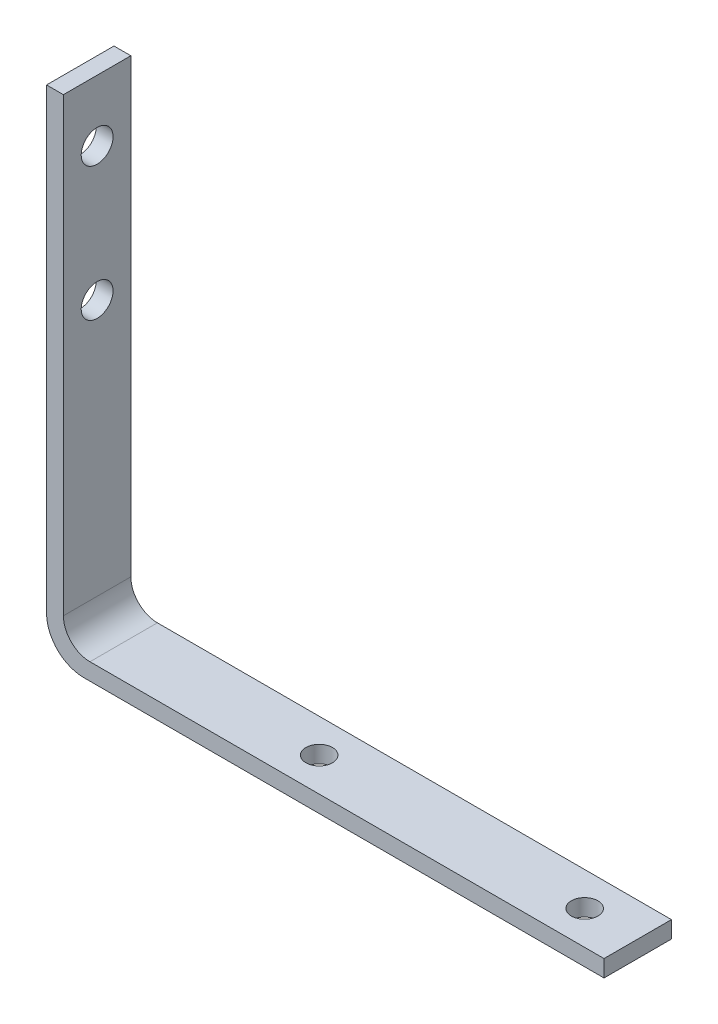
ISO-10303-21;
HEADER;
FILE_DESCRIPTION(('STEP AP214'),'2;1');
FILE_NAME('part.step','',(''),(''),'','','');
FILE_SCHEMA(('AUTOMOTIVE_DESIGN { 1 0 10303 214 1 1 1 1 }'));
ENDSEC;
DATA;
#1=APPLICATION_CONTEXT('core data for automotive mechanical design processes');
#2=APPLICATION_PROTOCOL_DEFINITION('international standard','automotive_design',2000,#1);
#3=PRODUCT_CONTEXT('',#1,'mechanical');
#4=PRODUCT('Part','Part','',(#3));
#5=PRODUCT_RELATED_PRODUCT_CATEGORY('part','',(#4));
#6=PRODUCT_DEFINITION_FORMATION('','',#4);
#7=PRODUCT_DEFINITION_CONTEXT('part definition',#1,'design');
#8=PRODUCT_DEFINITION('design','',#6,#7);
#9=PRODUCT_DEFINITION_SHAPE('','',#8);
#10=(LENGTH_UNIT() NAMED_UNIT(*) SI_UNIT(.MILLI.,.METRE.));
#11=(NAMED_UNIT(*) PLANE_ANGLE_UNIT() SI_UNIT($,.RADIAN.));
#12=(NAMED_UNIT(*) SI_UNIT($,.STERADIAN.) SOLID_ANGLE_UNIT());
#13=UNCERTAINTY_MEASURE_WITH_UNIT(LENGTH_MEASURE(1.E-05),#10,'distance_accuracy_value','');
#14=(GEOMETRIC_REPRESENTATION_CONTEXT(3) GLOBAL_UNCERTAINTY_ASSIGNED_CONTEXT((#13)) GLOBAL_UNIT_ASSIGNED_CONTEXT((#10,
#11,#12)) REPRESENTATION_CONTEXT('',''));
#15=CARTESIAN_POINT('',(0.,0.,0.));
#16=DIRECTION('',(0.,0.,1.));
#17=DIRECTION('',(1.,0.,0.));
#18=AXIS2_PLACEMENT_3D('',#15,#16,#17);
#19=CARTESIAN_POINT('',(0.,3.175,0.));
#20=DIRECTION('',(0.,-1.,0.));
#21=DIRECTION('',(0.,0.,-1.));
#22=AXIS2_PLACEMENT_3D('',#19,#20,#21);
#23=PLANE('',#22);
#24=CARTESIAN_POINT('',(-7.5,3.175,0.));
#25=DIRECTION('',(0.,1.,0.));
#26=DIRECTION('',(0.,0.,1.));
#27=AXIS2_PLACEMENT_3D('',#24,#25,#26);
#28=CIRCLE('',#27,2.49999999999999);
#29=CARTESIAN_POINT('',(-7.5,3.175,2.49999999999999));
#30=VERTEX_POINT('',#29);
#31=EDGE_CURVE('E140',#30,#30,#28,.T.);
#32=ORIENTED_EDGE('',*,*,#31,.F.);
#33=EDGE_LOOP('',(#32));
#34=FACE_BOUND('',#33,.T.);
#35=CARTESIAN_POINT('',(42.5,3.175,0.));
#36=DIRECTION('',(0.,1.,0.));
#37=DIRECTION('',(0.,0.,1.));
#38=AXIS2_PLACEMENT_3D('',#35,#36,#37);
#39=CIRCLE('',#38,2.49999999999999);
#40=CARTESIAN_POINT('',(42.5,3.175,2.49999999999999));
#41=VERTEX_POINT('',#40);
#42=EDGE_CURVE('E146',#41,#41,#39,.T.);
#43=ORIENTED_EDGE('',*,*,#42,.F.);
#44=EDGE_LOOP('',(#43));
#45=FACE_BOUND('',#44,.T.);
#46=DIRECTION('',(-1.,0.,0.));
#47=VECTOR('',#46,1.);
#48=CARTESIAN_POINT('',(-52.5,3.175,-6.35000000000002));
#49=LINE('',#48,#47);
#50=CARTESIAN_POINT('',(52.5,3.175,-6.34999999999998));
#51=VERTEX_POINT('',#50);
#52=CARTESIAN_POINT('',(-44.325,3.175,-6.35000000000002));
#53=VERTEX_POINT('',#52);
#54=EDGE_CURVE('E155',#51,#53,#49,.T.);
#55=ORIENTED_EDGE('',*,*,#54,.T.);
#56=DIRECTION('',(0.,0.,-1.));
#57=VECTOR('',#56,1.);
#58=CARTESIAN_POINT('',(-44.325,3.175,6.34999999999998));
#59=LINE('',#58,#57);
#60=CARTESIAN_POINT('',(-44.325,3.175,6.34999999999998));
#61=VERTEX_POINT('',#60);
#62=EDGE_CURVE('E175',#53,#61,#59,.F.);
#63=ORIENTED_EDGE('',*,*,#62,.T.);
#64=DIRECTION('',(1.,0.,0.));
#65=VECTOR('',#64,1.);
#66=CARTESIAN_POINT('',(-52.5,3.175,6.34999999999998));
#67=LINE('',#66,#65);
#68=CARTESIAN_POINT('',(52.5,3.175,6.34999999999998));
#69=VERTEX_POINT('',#68);
#70=EDGE_CURVE('E159',#61,#69,#67,.T.);
#71=ORIENTED_EDGE('',*,*,#70,.T.);
#72=DIRECTION('',(0.,0.,-1.));
#73=VECTOR('',#72,1.);
#74=CARTESIAN_POINT('',(52.5,3.175,6.34999999999998));
#75=LINE('',#74,#73);
#76=EDGE_CURVE('E152',#69,#51,#75,.T.);
#77=ORIENTED_EDGE('',*,*,#76,.T.);
#78=EDGE_LOOP('',(#55,#63,#71,#77));
#79=FACE_BOUND('',#78,.T.);
#80=ADVANCED_FACE('F37',(#34,#45,#79),#23,.F.);
#81=CARTESIAN_POINT('',(0.,0.,0.));
#82=DIRECTION('',(0.,-1.,0.));
#83=DIRECTION('',(0.,0.,-1.));
#84=AXIS2_PLACEMENT_3D('',#81,#82,#83);
#85=PLANE('',#84);
#86=CARTESIAN_POINT('',(42.5,0.,0.));
#87=DIRECTION('',(0.,1.,0.));
#88=DIRECTION('',(0.,0.,1.));
#89=AXIS2_PLACEMENT_3D('',#86,#87,#88);
#90=CIRCLE('',#89,2.49999999999999);
#91=CARTESIAN_POINT('',(42.5,0.,2.49999999999999));
#92=VERTEX_POINT('',#91);
#93=EDGE_CURVE('E143',#92,#92,#90,.T.);
#94=ORIENTED_EDGE('',*,*,#93,.T.);
#95=EDGE_LOOP('',(#94));
#96=FACE_BOUND('',#95,.T.);
#97=DIRECTION('',(1.,0.,0.));
#98=VECTOR('',#97,1.);
#99=CARTESIAN_POINT('',(-52.5,0.,6.34999999999998));
#100=LINE('',#99,#98);
#101=CARTESIAN_POINT('',(-45.5,0.,6.34999999999998));
#102=VERTEX_POINT('',#101);
#103=CARTESIAN_POINT('',(52.5,0.,6.34999999999998));
#104=VERTEX_POINT('',#103);
#105=EDGE_CURVE('E156',#102,#104,#100,.T.);
#106=ORIENTED_EDGE('',*,*,#105,.F.);
#107=DIRECTION('',(0.,0.,1.));
#108=VECTOR('',#107,1.);
#109=CARTESIAN_POINT('',(-45.5,0.,-6.35000000000002));
#110=LINE('',#109,#108);
#111=CARTESIAN_POINT('',(-45.5,0.,-6.35000000000002));
#112=VERTEX_POINT('',#111);
#113=EDGE_CURVE('E45',#102,#112,#110,.F.);
#114=ORIENTED_EDGE('',*,*,#113,.T.);
#115=DIRECTION('',(-1.,0.,0.));
#116=VECTOR('',#115,1.);
#117=CARTESIAN_POINT('',(-52.5,0.,-6.35000000000002));
#118=LINE('',#117,#116);
#119=CARTESIAN_POINT('',(52.5,0.,-6.34999999999998));
#120=VERTEX_POINT('',#119);
#121=EDGE_CURVE('E163',#120,#112,#118,.T.);
#122=ORIENTED_EDGE('',*,*,#121,.F.);
#123=DIRECTION('',(0.,0.,-1.));
#124=VECTOR('',#123,1.);
#125=CARTESIAN_POINT('',(52.5,0.,6.34999999999998));
#126=LINE('',#125,#124);
#127=EDGE_CURVE('E149',#104,#120,#126,.T.);
#128=ORIENTED_EDGE('',*,*,#127,.F.);
#129=EDGE_LOOP('',(#106,#114,#122,#128));
#130=FACE_BOUND('',#129,.T.);
#131=CARTESIAN_POINT('',(-7.5,0.,0.));
#132=DIRECTION('',(0.,1.,0.));
#133=DIRECTION('',(0.,0.,1.));
#134=AXIS2_PLACEMENT_3D('',#131,#132,#133);
#135=CIRCLE('',#134,2.49999999999999);
#136=CARTESIAN_POINT('',(-7.5,0.,2.49999999999999));
#137=VERTEX_POINT('',#136);
#138=EDGE_CURVE('E139',#137,#137,#135,.T.);
#139=ORIENTED_EDGE('',*,*,#138,.T.);
#140=EDGE_LOOP('',(#139));
#141=FACE_BOUND('',#140,.T.);
#142=ADVANCED_FACE('F208',(#96,#130,#141),#85,.T.);
#143=CARTESIAN_POINT('',(52.5,3.175,6.34999999999998));
#144=DIRECTION('',(-1.,0.,0.));
#145=DIRECTION('',(0.,0.,1.));
#146=AXIS2_PLACEMENT_3D('',#143,#144,#145);
#147=PLANE('',#146);
#148=ORIENTED_EDGE('',*,*,#127,.T.);
#149=DIRECTION('',(0.,-1.,0.));
#150=VECTOR('',#149,1.);
#151=CARTESIAN_POINT('',(52.5,3.175,-6.34999999999998));
#152=LINE('',#151,#150);
#153=EDGE_CURVE('E169',#51,#120,#152,.T.);
#154=ORIENTED_EDGE('',*,*,#153,.F.);
#155=ORIENTED_EDGE('',*,*,#76,.F.);
#156=DIRECTION('',(0.,-1.,0.));
#157=VECTOR('',#156,1.);
#158=CARTESIAN_POINT('',(52.5,3.175,6.34999999999998));
#159=LINE('',#158,#157);
#160=EDGE_CURVE('E109',#69,#104,#159,.T.);
#161=ORIENTED_EDGE('',*,*,#160,.T.);
#162=EDGE_LOOP('',(#148,#154,#155,#161));
#163=FACE_BOUND('',#162,.T.);
#164=ADVANCED_FACE('F198',(#163),#147,.F.);
#165=CARTESIAN_POINT('',(-52.5,3.175,-6.35000000000002));
#166=DIRECTION('',(0.,0.,1.));
#167=DIRECTION('',(1.,0.,0.));
#168=AXIS2_PLACEMENT_3D('',#165,#166,#167);
#169=PLANE('',#168);
#170=ORIENTED_EDGE('',*,*,#121,.T.);
#171=CARTESIAN_POINT('',(-45.5,7.,-6.35000000000002));
#172=DIRECTION('',(0.,0.,1.));
#173=DIRECTION('',(1.,0.,0.));
#174=AXIS2_PLACEMENT_3D('',#171,#172,#173);
#175=CIRCLE('',#174,7.);
#176=CARTESIAN_POINT('',(-52.5,7.,-6.35000000000002));
#177=VERTEX_POINT('',#176);
#178=EDGE_CURVE('E11',#112,#177,#175,.F.);
#179=ORIENTED_EDGE('',*,*,#178,.T.);
#180=DIRECTION('',(0.,-1.,0.));
#181=VECTOR('',#180,1.);
#182=CARTESIAN_POINT('',(-52.5,3.175,-6.35000000000002));
#183=LINE('',#182,#181);
#184=CARTESIAN_POINT('',(-52.5,93.175,-6.35000000000002));
#185=VERTEX_POINT('',#184);
#186=EDGE_CURVE('E108',#185,#177,#183,.T.);
#187=ORIENTED_EDGE('',*,*,#186,.F.);
#188=DIRECTION('',(-1.,0.,0.));
#189=VECTOR('',#188,1.);
#190=CARTESIAN_POINT('',(-52.5,93.175,-6.35000000000002));
#191=LINE('',#190,#189);
#192=CARTESIAN_POINT('',(-49.325,93.175,-6.35000000000002));
#193=VERTEX_POINT('',#192);
#194=EDGE_CURVE('E123',#193,#185,#191,.T.);
#195=ORIENTED_EDGE('',*,*,#194,.F.);
#196=DIRECTION('',(0.,-1.,0.));
#197=VECTOR('',#196,1.);
#198=CARTESIAN_POINT('',(-49.325,93.175,-6.35000000000002));
#199=LINE('',#198,#197);
#200=CARTESIAN_POINT('',(-49.325,8.17500000000003,-6.35000000000002));
#201=VERTEX_POINT('',#200);
#202=EDGE_CURVE('E135',#193,#201,#199,.T.);
#203=ORIENTED_EDGE('',*,*,#202,.T.);
#204=CARTESIAN_POINT('',(-44.325,8.175,-6.35000000000002));
#205=DIRECTION('',(0.,0.,1.));
#206=DIRECTION('',(1.,0.,0.));
#207=AXIS2_PLACEMENT_3D('',#204,#205,#206);
#208=CIRCLE('',#207,5.);
#209=EDGE_CURVE('E177',#201,#53,#208,.T.);
#210=ORIENTED_EDGE('',*,*,#209,.T.);
#211=ORIENTED_EDGE('',*,*,#54,.F.);
#212=ORIENTED_EDGE('',*,*,#153,.T.);
#213=EDGE_LOOP('',(#170,#179,#187,#195,#203,#210,#211,#212));
#214=FACE_BOUND('',#213,.T.);
#215=ADVANCED_FACE('F193',(#214),#169,.F.);
#216=CARTESIAN_POINT('',(-52.5,3.175,6.34999999999998));
#217=DIRECTION('',(1.,0.,0.));
#218=DIRECTION('',(0.,0.,-1.));
#219=AXIS2_PLACEMENT_3D('',#216,#217,#218);
#220=PLANE('',#219);
#221=CARTESIAN_POINT('',(-52.5,56.51,0.));
#222=DIRECTION('',(-1.,0.,0.));
#223=DIRECTION('',(0.,0.,1.));
#224=AXIS2_PLACEMENT_3D('',#221,#222,#223);
#225=CIRCLE('',#224,3.);
#226=CARTESIAN_POINT('',(-52.5,56.51,3.));
#227=VERTEX_POINT('',#226);
#228=EDGE_CURVE('E127',#227,#227,#225,.T.);
#229=ORIENTED_EDGE('',*,*,#228,.F.);
#230=EDGE_LOOP('',(#229));
#231=FACE_BOUND('',#230,.T.);
#232=CARTESIAN_POINT('',(-52.5,81.656,0.));
#233=DIRECTION('',(-1.,0.,0.));
#234=DIRECTION('',(0.,0.,1.));
#235=AXIS2_PLACEMENT_3D('',#232,#233,#234);
#236=CIRCLE('',#235,3.);
#237=CARTESIAN_POINT('',(-52.5,81.656,3.));
#238=VERTEX_POINT('',#237);
#239=EDGE_CURVE('E130',#238,#238,#236,.T.);
#240=ORIENTED_EDGE('',*,*,#239,.F.);
#241=EDGE_LOOP('',(#240));
#242=FACE_BOUND('',#241,.T.);
#243=ORIENTED_EDGE('',*,*,#186,.T.);
#244=DIRECTION('',(0.,0.,1.));
#245=VECTOR('',#244,1.);
#246=CARTESIAN_POINT('',(-52.5,7.,6.34999999999998));
#247=LINE('',#246,#245);
#248=CARTESIAN_POINT('',(-52.5,7.,6.34999999999998));
#249=VERTEX_POINT('',#248);
#250=EDGE_CURVE('E107',#177,#249,#247,.T.);
#251=ORIENTED_EDGE('',*,*,#250,.T.);
#252=DIRECTION('',(0.,-1.,0.));
#253=VECTOR('',#252,1.);
#254=CARTESIAN_POINT('',(-52.5,3.175,6.34999999999998));
#255=LINE('',#254,#253);
#256=CARTESIAN_POINT('',(-52.5,93.175,6.34999999999998));
#257=VERTEX_POINT('',#256);
#258=EDGE_CURVE('E100',#257,#249,#255,.T.);
#259=ORIENTED_EDGE('',*,*,#258,.F.);
#260=DIRECTION('',(0.,0.,1.));
#261=VECTOR('',#260,1.);
#262=CARTESIAN_POINT('',(-52.5,93.175,-6.35000000000002));
#263=LINE('',#262,#261);
#264=EDGE_CURVE('E105',#185,#257,#263,.T.);
#265=ORIENTED_EDGE('',*,*,#264,.F.);
#266=EDGE_LOOP('',(#243,#251,#259,#265));
#267=FACE_BOUND('',#266,.T.);
#268=ADVANCED_FACE('F103',(#231,#242,#267),#220,.F.);
#269=CARTESIAN_POINT('',(-52.5,3.175,6.34999999999998));
#270=DIRECTION('',(0.,0.,-1.));
#271=DIRECTION('',(-1.,0.,0.));
#272=AXIS2_PLACEMENT_3D('',#269,#270,#271);
#273=PLANE('',#272);
#274=ORIENTED_EDGE('',*,*,#258,.T.);
#275=CARTESIAN_POINT('',(-45.5,7.,6.34999999999998));
#276=DIRECTION('',(0.,0.,-1.));
#277=DIRECTION('',(-1.,0.,0.));
#278=AXIS2_PLACEMENT_3D('',#275,#276,#277);
#279=CIRCLE('',#278,7.);
#280=EDGE_CURVE('E59',#249,#102,#279,.F.);
#281=ORIENTED_EDGE('',*,*,#280,.T.);
#282=ORIENTED_EDGE('',*,*,#105,.T.);
#283=ORIENTED_EDGE('',*,*,#160,.F.);
#284=ORIENTED_EDGE('',*,*,#70,.F.);
#285=CARTESIAN_POINT('',(-44.325,8.175,6.34999999999998));
#286=DIRECTION('',(0.,0.,-1.));
#287=DIRECTION('',(-1.,0.,0.));
#288=AXIS2_PLACEMENT_3D('',#285,#286,#287);
#289=CIRCLE('',#288,5.);
#290=CARTESIAN_POINT('',(-49.325,8.17500000000003,6.34999999999998));
#291=VERTEX_POINT('',#290);
#292=EDGE_CURVE('E179',#61,#291,#289,.T.);
#293=ORIENTED_EDGE('',*,*,#292,.T.);
#294=DIRECTION('',(0.,-1.,0.));
#295=VECTOR('',#294,1.);
#296=CARTESIAN_POINT('',(-49.325,93.175,6.34999999999998));
#297=LINE('',#296,#295);
#298=CARTESIAN_POINT('',(-49.325,93.175,6.34999999999998));
#299=VERTEX_POINT('',#298);
#300=EDGE_CURVE('E115',#299,#291,#297,.T.);
#301=ORIENTED_EDGE('',*,*,#300,.F.);
#302=DIRECTION('',(1.,0.,0.));
#303=VECTOR('',#302,1.);
#304=CARTESIAN_POINT('',(-52.5,93.175,6.34999999999998));
#305=LINE('',#304,#303);
#306=EDGE_CURVE('E112',#257,#299,#305,.T.);
#307=ORIENTED_EDGE('',*,*,#306,.F.);
#308=EDGE_LOOP('',(#274,#281,#282,#283,#284,#293,#301,#307));
#309=FACE_BOUND('',#308,.T.);
#310=ADVANCED_FACE('F113',(#309),#273,.F.);
#311=CARTESIAN_POINT('',(42.5,3.175,0.));
#312=DIRECTION('',(0.,-1.,0.));
#313=DIRECTION('',(0.,0.,-1.));
#314=AXIS2_PLACEMENT_3D('',#311,#312,#313);
#315=CYLINDRICAL_SURFACE('',#314,2.49999999999999);
#316=ORIENTED_EDGE('',*,*,#42,.T.);
#317=EDGE_LOOP('',(#316));
#318=FACE_BOUND('',#317,.T.);
#319=ORIENTED_EDGE('',*,*,#93,.F.);
#320=EDGE_LOOP('',(#319));
#321=FACE_BOUND('',#320,.T.);
#322=ADVANCED_FACE('F219',(#318,#321),#315,.F.);
#323=CARTESIAN_POINT('',(-7.5,3.175,0.));
#324=DIRECTION('',(0.,-1.,0.));
#325=DIRECTION('',(0.,0.,-1.));
#326=AXIS2_PLACEMENT_3D('',#323,#324,#325);
#327=CYLINDRICAL_SURFACE('',#326,2.49999999999999);
#328=ORIENTED_EDGE('',*,*,#31,.T.);
#329=EDGE_LOOP('',(#328));
#330=FACE_BOUND('',#329,.T.);
#331=ORIENTED_EDGE('',*,*,#138,.F.);
#332=EDGE_LOOP('',(#331));
#333=FACE_BOUND('',#332,.T.);
#334=ADVANCED_FACE('F252',(#330,#333),#327,.F.);
#335=CARTESIAN_POINT('',(-49.325,93.175,-6.35000000000002));
#336=DIRECTION('',(-1.,0.,0.));
#337=DIRECTION('',(0.,0.,1.));
#338=AXIS2_PLACEMENT_3D('',#335,#336,#337);
#339=PLANE('',#338);
#340=CARTESIAN_POINT('',(-49.325,56.51,0.));
#341=DIRECTION('',(-1.,0.,0.));
#342=DIRECTION('',(0.,0.,1.));
#343=AXIS2_PLACEMENT_3D('',#340,#341,#342);
#344=CIRCLE('',#343,3.);
#345=CARTESIAN_POINT('',(-49.325,56.51,3.));
#346=VERTEX_POINT('',#345);
#347=EDGE_CURVE('E124',#346,#346,#344,.T.);
#348=ORIENTED_EDGE('',*,*,#347,.T.);
#349=EDGE_LOOP('',(#348));
#350=FACE_BOUND('',#349,.T.);
#351=CARTESIAN_POINT('',(-49.325,81.656,0.));
#352=DIRECTION('',(-1.,0.,0.));
#353=DIRECTION('',(0.,0.,1.));
#354=AXIS2_PLACEMENT_3D('',#351,#352,#353);
#355=CIRCLE('',#354,3.);
#356=CARTESIAN_POINT('',(-49.325,81.656,3.));
#357=VERTEX_POINT('',#356);
#358=EDGE_CURVE('E368',#357,#357,#355,.T.);
#359=ORIENTED_EDGE('',*,*,#358,.T.);
#360=EDGE_LOOP('',(#359));
#361=FACE_BOUND('',#360,.T.);
#362=ORIENTED_EDGE('',*,*,#300,.T.);
#363=DIRECTION('',(0.,0.,-1.));
#364=VECTOR('',#363,1.);
#365=CARTESIAN_POINT('',(-49.325,8.175,-6.35000000000002));
#366=LINE('',#365,#364);
#367=EDGE_CURVE('E172',#291,#201,#366,.T.);
#368=ORIENTED_EDGE('',*,*,#367,.T.);
#369=ORIENTED_EDGE('',*,*,#202,.F.);
#370=DIRECTION('',(0.,0.,-1.));
#371=VECTOR('',#370,1.);
#372=CARTESIAN_POINT('',(-49.325,93.175,-6.35000000000002));
#373=LINE('',#372,#371);
#374=EDGE_CURVE('E118',#299,#193,#373,.T.);
#375=ORIENTED_EDGE('',*,*,#374,.F.);
#376=EDGE_LOOP('',(#362,#368,#369,#375));
#377=FACE_BOUND('',#376,.T.);
#378=ADVANCED_FACE('F189',(#350,#361,#377),#339,.F.);
#379=CARTESIAN_POINT('',(0.,93.175,0.));
#380=DIRECTION('',(0.,1.,0.));
#381=DIRECTION('',(0.,0.,1.));
#382=AXIS2_PLACEMENT_3D('',#379,#380,#381);
#383=PLANE('',#382);
#384=ORIENTED_EDGE('',*,*,#264,.T.);
#385=ORIENTED_EDGE('',*,*,#306,.T.);
#386=ORIENTED_EDGE('',*,*,#374,.T.);
#387=ORIENTED_EDGE('',*,*,#194,.T.);
#388=EDGE_LOOP('',(#384,#385,#386,#387));
#389=FACE_BOUND('',#388,.T.);
#390=ADVANCED_FACE('F121',(#389),#383,.T.);
#391=CARTESIAN_POINT('',(-49.325,81.656,0.));
#392=DIRECTION('',(-1.,0.,0.));
#393=DIRECTION('',(0.,0.,1.));
#394=AXIS2_PLACEMENT_3D('',#391,#392,#393);
#395=CYLINDRICAL_SURFACE('',#394,3.);
#396=ORIENTED_EDGE('',*,*,#358,.F.);
#397=EDGE_LOOP('',(#396));
#398=FACE_BOUND('',#397,.T.);
#399=ORIENTED_EDGE('',*,*,#239,.T.);
#400=EDGE_LOOP('',(#399));
#401=FACE_BOUND('',#400,.T.);
#402=ADVANCED_FACE('F273',(#398,#401),#395,.F.);
#403=CARTESIAN_POINT('',(-49.325,56.51,0.));
#404=DIRECTION('',(-1.,0.,0.));
#405=DIRECTION('',(0.,0.,1.));
#406=AXIS2_PLACEMENT_3D('',#403,#404,#405);
#407=CYLINDRICAL_SURFACE('',#406,3.);
#408=ORIENTED_EDGE('',*,*,#347,.F.);
#409=EDGE_LOOP('',(#408));
#410=FACE_BOUND('',#409,.T.);
#411=ORIENTED_EDGE('',*,*,#228,.T.);
#412=EDGE_LOOP('',(#411));
#413=FACE_BOUND('',#412,.T.);
#414=ADVANCED_FACE('F206',(#410,#413),#407,.F.);
#415=CARTESIAN_POINT('',(-44.325,8.175,-6.35000000000002));
#416=DIRECTION('',(0.,0.,1.));
#417=DIRECTION('',(1.,0.,0.));
#418=AXIS2_PLACEMENT_3D('',#415,#416,#417);
#419=CYLINDRICAL_SURFACE('',#418,5.);
#420=ORIENTED_EDGE('',*,*,#292,.F.);
#421=ORIENTED_EDGE('',*,*,#62,.F.);
#422=ORIENTED_EDGE('',*,*,#209,.F.);
#423=ORIENTED_EDGE('',*,*,#367,.F.);
#424=EDGE_LOOP('',(#420,#421,#422,#423));
#425=FACE_BOUND('',#424,.T.);
#426=ADVANCED_FACE('F191',(#425),#419,.F.);
#427=CARTESIAN_POINT('',(-45.5,7.,6.34999999999998));
#428=DIRECTION('',(0.,0.,-1.));
#429=DIRECTION('',(-1.,0.,0.));
#430=AXIS2_PLACEMENT_3D('',#427,#428,#429);
#431=CYLINDRICAL_SURFACE('',#430,7.);
#432=ORIENTED_EDGE('',*,*,#178,.F.);
#433=ORIENTED_EDGE('',*,*,#113,.F.);
#434=ORIENTED_EDGE('',*,*,#280,.F.);
#435=ORIENTED_EDGE('',*,*,#250,.F.);
#436=EDGE_LOOP('',(#432,#433,#434,#435));
#437=FACE_BOUND('',#436,.T.);
#438=ADVANCED_FACE('F39',(#437),#431,.T.);
#439=CLOSED_SHELL('',(#80,#142,#164,#215,#268,#310,#322,#334,#378,#390,#402,#414,#426,#438));
#440=MANIFOLD_SOLID_BREP('B2',#439);
#441=ADVANCED_BREP_SHAPE_REPRESENTATION('',(#18,#440),#14);
#442=SHAPE_DEFINITION_REPRESENTATION(#9,#441);
ENDSEC;
END-ISO-10303-21;
